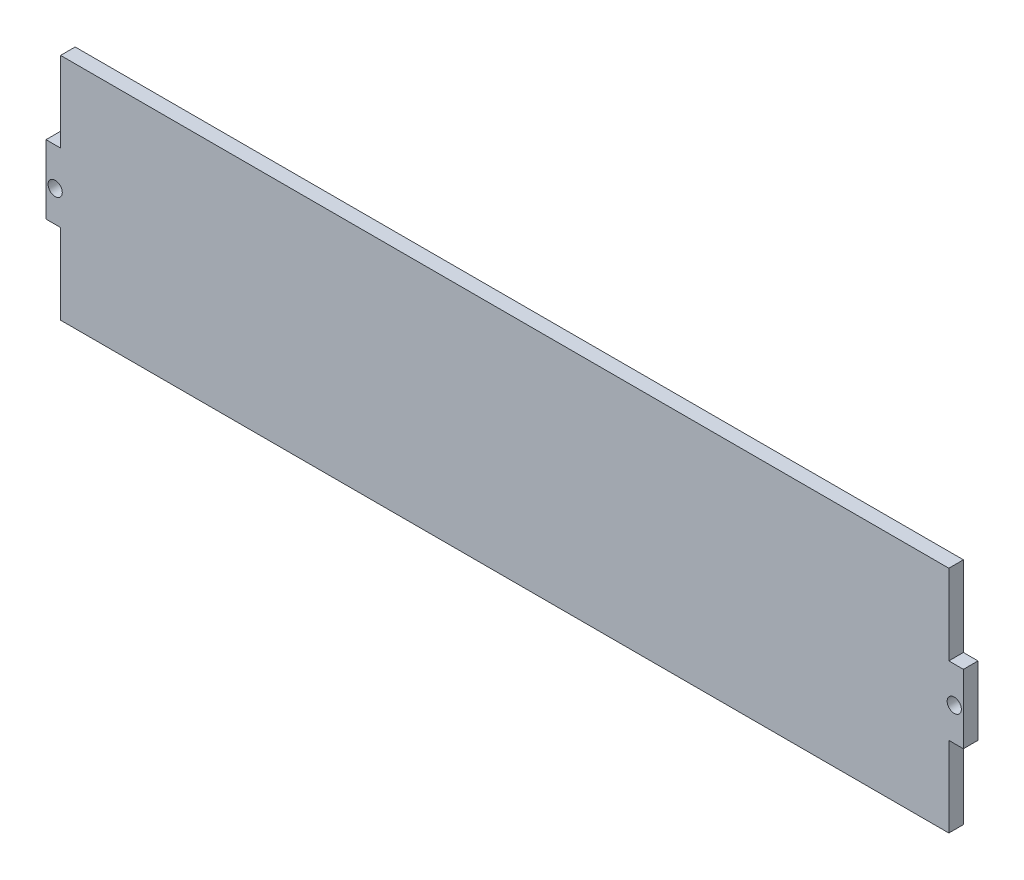
ISO-10303-21;
HEADER;
FILE_DESCRIPTION(('STEP AP214'),'2;1');
FILE_NAME('part.step','',(''),(''),'','','');
FILE_SCHEMA(('AUTOMOTIVE_DESIGN { 1 0 10303 214 1 1 1 1 }'));
ENDSEC;
DATA;
#1=APPLICATION_CONTEXT('core data for automotive mechanical design processes');
#2=APPLICATION_PROTOCOL_DEFINITION('international standard','automotive_design',2000,#1);
#3=PRODUCT_CONTEXT('',#1,'mechanical');
#4=PRODUCT('Part','Part','',(#3));
#5=PRODUCT_RELATED_PRODUCT_CATEGORY('part','',(#4));
#6=PRODUCT_DEFINITION_FORMATION('','',#4);
#7=PRODUCT_DEFINITION_CONTEXT('part definition',#1,'design');
#8=PRODUCT_DEFINITION('design','',#6,#7);
#9=PRODUCT_DEFINITION_SHAPE('','',#8);
#10=(LENGTH_UNIT() NAMED_UNIT(*) SI_UNIT(.MILLI.,.METRE.));
#11=(NAMED_UNIT(*) PLANE_ANGLE_UNIT() SI_UNIT($,.RADIAN.));
#12=(NAMED_UNIT(*) SI_UNIT($,.STERADIAN.) SOLID_ANGLE_UNIT());
#13=UNCERTAINTY_MEASURE_WITH_UNIT(LENGTH_MEASURE(1.E-05),#10,'distance_accuracy_value','');
#14=(GEOMETRIC_REPRESENTATION_CONTEXT(3) GLOBAL_UNCERTAINTY_ASSIGNED_CONTEXT((#13)) GLOBAL_UNIT_ASSIGNED_CONTEXT((#10,
#11,#12)) REPRESENTATION_CONTEXT('',''));
#15=CARTESIAN_POINT('',(0.,0.,0.));
#16=DIRECTION('',(0.,0.,1.));
#17=DIRECTION('',(1.,0.,0.));
#18=AXIS2_PLACEMENT_3D('',#15,#16,#17);
#19=CARTESIAN_POINT('',(-100.,-25.,3.18));
#20=DIRECTION('',(-1.,0.,0.));
#21=DIRECTION('',(0.,0.,1.));
#22=AXIS2_PLACEMENT_3D('',#19,#20,#21);
#23=PLANE('',#22);
#24=DIRECTION('',(0.,0.,1.));
#25=VECTOR('',#24,1.);
#26=CARTESIAN_POINT('',(-100.,-7.5,0.));
#27=LINE('',#26,#25);
#28=CARTESIAN_POINT('',(-100.,-7.5,0.));
#29=VERTEX_POINT('',#28);
#30=CARTESIAN_POINT('',(-100.,-7.5,3.18));
#31=VERTEX_POINT('',#30);
#32=EDGE_CURVE('E196',#29,#31,#27,.T.);
#33=ORIENTED_EDGE('',*,*,#32,.T.);
#34=DIRECTION('',(0.,1.,0.));
#35=VECTOR('',#34,1.);
#36=CARTESIAN_POINT('',(-100.,-25.,3.18));
#37=LINE('',#36,#35);
#38=CARTESIAN_POINT('',(-100.,7.5,3.18));
#39=VERTEX_POINT('',#38);
#40=EDGE_CURVE('E160',#31,#39,#37,.T.);
#41=ORIENTED_EDGE('',*,*,#40,.T.);
#42=DIRECTION('',(0.,0.,1.));
#43=VECTOR('',#42,1.);
#44=CARTESIAN_POINT('',(-100.,7.5,0.));
#45=LINE('',#44,#43);
#46=CARTESIAN_POINT('',(-100.,7.5,0.));
#47=VERTEX_POINT('',#46);
#48=EDGE_CURVE('E178',#47,#39,#45,.T.);
#49=ORIENTED_EDGE('',*,*,#48,.F.);
#50=DIRECTION('',(0.,1.,0.));
#51=VECTOR('',#50,1.);
#52=CARTESIAN_POINT('',(-100.,-25.,0.));
#53=LINE('',#52,#51);
#54=EDGE_CURVE('E162',#29,#47,#53,.T.);
#55=ORIENTED_EDGE('',*,*,#54,.F.);
#56=EDGE_LOOP('',(#33,#41,#49,#55));
#57=FACE_BOUND('',#56,.T.);
#58=ADVANCED_FACE('F39',(#57),#23,.T.);
#59=CARTESIAN_POINT('',(-100.,-25.,3.18));
#60=DIRECTION('',(0.,1.,0.));
#61=DIRECTION('',(0.,0.,1.));
#62=AXIS2_PLACEMENT_3D('',#59,#60,#61);
#63=PLANE('',#62);
#64=DIRECTION('',(1.,0.,0.));
#65=VECTOR('',#64,1.);
#66=CARTESIAN_POINT('',(-100.,-25.,3.18));
#67=LINE('',#66,#65);
#68=CARTESIAN_POINT('',(-96.82,-25.,3.18));
#69=VERTEX_POINT('',#68);
#70=CARTESIAN_POINT('',(96.82,-25.,3.18));
#71=VERTEX_POINT('',#70);
#72=EDGE_CURVE('E11',#69,#71,#67,.T.);
#73=ORIENTED_EDGE('',*,*,#72,.F.);
#74=DIRECTION('',(0.,0.,1.));
#75=VECTOR('',#74,1.);
#76=CARTESIAN_POINT('',(-96.82,-25.,0.));
#77=LINE('',#76,#75);
#78=CARTESIAN_POINT('',(-96.82,-25.,0.));
#79=VERTEX_POINT('',#78);
#80=EDGE_CURVE('E226',#79,#69,#77,.T.);
#81=ORIENTED_EDGE('',*,*,#80,.F.);
#82=DIRECTION('',(1.,0.,0.));
#83=VECTOR('',#82,1.);
#84=CARTESIAN_POINT('',(-100.,-25.,0.));
#85=LINE('',#84,#83);
#86=CARTESIAN_POINT('',(96.82,-25.,0.));
#87=VERTEX_POINT('',#86);
#88=EDGE_CURVE('E42',#79,#87,#85,.T.);
#89=ORIENTED_EDGE('',*,*,#88,.T.);
#90=DIRECTION('',(0.,0.,1.));
#91=VECTOR('',#90,1.);
#92=CARTESIAN_POINT('',(96.82,-25.,0.));
#93=LINE('',#92,#91);
#94=EDGE_CURVE('E221',#87,#71,#93,.T.);
#95=ORIENTED_EDGE('',*,*,#94,.T.);
#96=EDGE_LOOP('',(#73,#81,#89,#95));
#97=FACE_BOUND('',#96,.T.);
#98=ADVANCED_FACE('F307',(#97),#63,.F.);
#99=CARTESIAN_POINT('',(100.,-25.,3.18));
#100=DIRECTION('',(-1.,0.,0.));
#101=DIRECTION('',(0.,0.,1.));
#102=AXIS2_PLACEMENT_3D('',#99,#100,#101);
#103=PLANE('',#102);
#104=DIRECTION('',(0.,1.,0.));
#105=VECTOR('',#104,1.);
#106=CARTESIAN_POINT('',(100.,-25.,0.));
#107=LINE('',#106,#105);
#108=CARTESIAN_POINT('',(100.,-7.5,0.));
#109=VERTEX_POINT('',#108);
#110=CARTESIAN_POINT('',(100.,7.5,0.));
#111=VERTEX_POINT('',#110);
#112=EDGE_CURVE('E149',#109,#111,#107,.T.);
#113=ORIENTED_EDGE('',*,*,#112,.T.);
#114=DIRECTION('',(0.,0.,1.));
#115=VECTOR('',#114,1.);
#116=CARTESIAN_POINT('',(100.,7.5,0.));
#117=LINE('',#116,#115);
#118=CARTESIAN_POINT('',(100.,7.5,3.18));
#119=VERTEX_POINT('',#118);
#120=EDGE_CURVE('E209',#111,#119,#117,.T.);
#121=ORIENTED_EDGE('',*,*,#120,.T.);
#122=DIRECTION('',(0.,1.,0.));
#123=VECTOR('',#122,1.);
#124=CARTESIAN_POINT('',(100.,-25.,3.18));
#125=LINE('',#124,#123);
#126=CARTESIAN_POINT('',(100.,-7.5,3.18));
#127=VERTEX_POINT('',#126);
#128=EDGE_CURVE('E48',#127,#119,#125,.T.);
#129=ORIENTED_EDGE('',*,*,#128,.F.);
#130=DIRECTION('',(0.,0.,1.));
#131=VECTOR('',#130,1.);
#132=CARTESIAN_POINT('',(100.,-7.5,0.));
#133=LINE('',#132,#131);
#134=EDGE_CURVE('E134',#109,#127,#133,.T.);
#135=ORIENTED_EDGE('',*,*,#134,.F.);
#136=EDGE_LOOP('',(#113,#121,#129,#135));
#137=FACE_BOUND('',#136,.T.);
#138=ADVANCED_FACE('F147',(#137),#103,.F.);
#139=CARTESIAN_POINT('',(-100.,25.,3.18));
#140=DIRECTION('',(0.,1.,0.));
#141=DIRECTION('',(0.,0.,1.));
#142=AXIS2_PLACEMENT_3D('',#139,#140,#141);
#143=PLANE('',#142);
#144=DIRECTION('',(0.,0.,1.));
#145=VECTOR('',#144,1.);
#146=CARTESIAN_POINT('',(96.82,25.,0.));
#147=LINE('',#146,#145);
#148=CARTESIAN_POINT('',(96.82,25.,0.));
#149=VERTEX_POINT('',#148);
#150=CARTESIAN_POINT('',(96.82,25.,3.18));
#151=VERTEX_POINT('',#150);
#152=EDGE_CURVE('E203',#149,#151,#147,.T.);
#153=ORIENTED_EDGE('',*,*,#152,.F.);
#154=DIRECTION('',(1.,0.,0.));
#155=VECTOR('',#154,1.);
#156=CARTESIAN_POINT('',(-100.,25.,0.));
#157=LINE('',#156,#155);
#158=CARTESIAN_POINT('',(-96.82,25.,0.));
#159=VERTEX_POINT('',#158);
#160=EDGE_CURVE('E156',#159,#149,#157,.T.);
#161=ORIENTED_EDGE('',*,*,#160,.F.);
#162=DIRECTION('',(0.,0.,1.));
#163=VECTOR('',#162,1.);
#164=CARTESIAN_POINT('',(-96.82,25.,0.));
#165=LINE('',#164,#163);
#166=CARTESIAN_POINT('',(-96.82,25.,3.18));
#167=VERTEX_POINT('',#166);
#168=EDGE_CURVE('E167',#159,#167,#165,.T.);
#169=ORIENTED_EDGE('',*,*,#168,.T.);
#170=DIRECTION('',(1.,0.,0.));
#171=VECTOR('',#170,1.);
#172=CARTESIAN_POINT('',(-100.,25.,3.18));
#173=LINE('',#172,#171);
#174=EDGE_CURVE('E171',#167,#151,#173,.T.);
#175=ORIENTED_EDGE('',*,*,#174,.T.);
#176=EDGE_LOOP('',(#153,#161,#169,#175));
#177=FACE_BOUND('',#176,.T.);
#178=ADVANCED_FACE('F288',(#177),#143,.T.);
#179=CARTESIAN_POINT('',(0.,0.,3.18));
#180=DIRECTION('',(0.,0.,-1.));
#181=DIRECTION('',(-1.,0.,0.));
#182=AXIS2_PLACEMENT_3D('',#179,#180,#181);
#183=PLANE('',#182);
#184=CARTESIAN_POINT('',(-98.,-0.707640919363736,3.18));
#185=DIRECTION('',(0.,0.,1.));
#186=DIRECTION('',(1.,0.,0.));
#187=AXIS2_PLACEMENT_3D('',#184,#185,#186);
#188=CIRCLE('',#187,1.54999999999999);
#189=CARTESIAN_POINT('',(-96.45,-0.707640919363736,3.18));
#190=VERTEX_POINT('',#189);
#191=EDGE_CURVE('E268',#190,#190,#188,.T.);
#192=ORIENTED_EDGE('',*,*,#191,.F.);
#193=EDGE_LOOP('',(#192));
#194=FACE_BOUND('',#193,.T.);
#195=CARTESIAN_POINT('',(98.0021584093861,-0.278752170109062,3.18));
#196=DIRECTION('',(0.,0.,1.));
#197=DIRECTION('',(-1.,0.,0.));
#198=AXIS2_PLACEMENT_3D('',#195,#196,#197);
#199=CIRCLE('',#198,1.54999999999999);
#200=CARTESIAN_POINT('',(99.5521584093861,-0.278752170109062,3.18));
#201=VERTEX_POINT('',#200);
#202=EDGE_CURVE('E260',#201,#201,#199,.T.);
#203=ORIENTED_EDGE('',*,*,#202,.F.);
#204=EDGE_LOOP('',(#203));
#205=FACE_BOUND('',#204,.T.);
#206=ORIENTED_EDGE('',*,*,#40,.F.);
#207=DIRECTION('',(-1.,0.,0.));
#208=VECTOR('',#207,1.);
#209=CARTESIAN_POINT('',(-100.,-7.5,3.18));
#210=LINE('',#209,#208);
#211=CARTESIAN_POINT('',(-96.82,-7.5,3.18));
#212=VERTEX_POINT('',#211);
#213=EDGE_CURVE('E235',#212,#31,#210,.T.);
#214=ORIENTED_EDGE('',*,*,#213,.F.);
#215=DIRECTION('',(0.,1.,0.));
#216=VECTOR('',#215,1.);
#217=CARTESIAN_POINT('',(-96.82,-7.5,3.18));
#218=LINE('',#217,#216);
#219=EDGE_CURVE('E212',#69,#212,#218,.T.);
#220=ORIENTED_EDGE('',*,*,#219,.F.);
#221=ORIENTED_EDGE('',*,*,#72,.T.);
#222=DIRECTION('',(0.,-1.,0.));
#223=VECTOR('',#222,1.);
#224=CARTESIAN_POINT('',(96.82,-25.,3.18));
#225=LINE('',#224,#223);
#226=CARTESIAN_POINT('',(96.82,-7.5,3.18));
#227=VERTEX_POINT('',#226);
#228=EDGE_CURVE('E142',#227,#71,#225,.T.);
#229=ORIENTED_EDGE('',*,*,#228,.F.);
#230=DIRECTION('',(-1.,0.,0.));
#231=VECTOR('',#230,1.);
#232=CARTESIAN_POINT('',(100.,-7.5,3.18));
#233=LINE('',#232,#231);
#234=EDGE_CURVE('E254',#127,#227,#233,.T.);
#235=ORIENTED_EDGE('',*,*,#234,.F.);
#236=ORIENTED_EDGE('',*,*,#128,.T.);
#237=DIRECTION('',(1.,0.,0.));
#238=VECTOR('',#237,1.);
#239=CARTESIAN_POINT('',(100.,7.5,3.18));
#240=LINE('',#239,#238);
#241=CARTESIAN_POINT('',(96.82,7.5,3.18));
#242=VERTEX_POINT('',#241);
#243=EDGE_CURVE('E213',#242,#119,#240,.T.);
#244=ORIENTED_EDGE('',*,*,#243,.F.);
#245=DIRECTION('',(0.,-1.,0.));
#246=VECTOR('',#245,1.);
#247=CARTESIAN_POINT('',(96.82,25.,3.18));
#248=LINE('',#247,#246);
#249=EDGE_CURVE('E217',#151,#242,#248,.T.);
#250=ORIENTED_EDGE('',*,*,#249,.F.);
#251=ORIENTED_EDGE('',*,*,#174,.F.);
#252=DIRECTION('',(0.,1.,0.));
#253=VECTOR('',#252,1.);
#254=CARTESIAN_POINT('',(-96.82,25.,3.18));
#255=LINE('',#254,#253);
#256=CARTESIAN_POINT('',(-96.82,7.5,3.18));
#257=VERTEX_POINT('',#256);
#258=EDGE_CURVE('E188',#257,#167,#255,.T.);
#259=ORIENTED_EDGE('',*,*,#258,.F.);
#260=DIRECTION('',(1.,0.,0.));
#261=VECTOR('',#260,1.);
#262=CARTESIAN_POINT('',(-100.,7.5,3.18));
#263=LINE('',#262,#261);
#264=EDGE_CURVE('E192',#39,#257,#263,.T.);
#265=ORIENTED_EDGE('',*,*,#264,.F.);
#266=EDGE_LOOP('',(#206,#214,#220,#221,#229,#235,#236,#244,#250,#251,#259,#265));
#267=FACE_BOUND('',#266,.T.);
#268=ADVANCED_FACE('F285',(#194,#205,#267),#183,.F.);
#269=CARTESIAN_POINT('',(0.,0.,0.));
#270=DIRECTION('',(0.,0.,-1.));
#271=DIRECTION('',(-1.,0.,0.));
#272=AXIS2_PLACEMENT_3D('',#269,#270,#271);
#273=PLANE('',#272);
#274=CARTESIAN_POINT('',(-98.,-0.707640919363736,0.));
#275=DIRECTION('',(0.,0.,1.));
#276=DIRECTION('',(1.,0.,0.));
#277=AXIS2_PLACEMENT_3D('',#274,#275,#276);
#278=CIRCLE('',#277,1.54999999999999);
#279=CARTESIAN_POINT('',(-96.45,-0.707640919363736,0.));
#280=VERTEX_POINT('',#279);
#281=EDGE_CURVE('E257',#280,#280,#278,.T.);
#282=ORIENTED_EDGE('',*,*,#281,.T.);
#283=EDGE_LOOP('',(#282));
#284=FACE_BOUND('',#283,.T.);
#285=CARTESIAN_POINT('',(98.0021584093861,-0.278752170109062,0.));
#286=DIRECTION('',(0.,0.,1.));
#287=DIRECTION('',(-1.,0.,0.));
#288=AXIS2_PLACEMENT_3D('',#285,#286,#287);
#289=CIRCLE('',#288,1.54999999999999);
#290=CARTESIAN_POINT('',(99.5521584093861,-0.278752170109062,0.));
#291=VERTEX_POINT('',#290);
#292=EDGE_CURVE('E264',#291,#291,#289,.T.);
#293=ORIENTED_EDGE('',*,*,#292,.T.);
#294=EDGE_LOOP('',(#293));
#295=FACE_BOUND('',#294,.T.);
#296=DIRECTION('',(-1.,0.,0.));
#297=VECTOR('',#296,1.);
#298=CARTESIAN_POINT('',(-100.,-7.5,0.));
#299=LINE('',#298,#297);
#300=CARTESIAN_POINT('',(-96.82,-7.5,0.));
#301=VERTEX_POINT('',#300);
#302=EDGE_CURVE('E56',#301,#29,#299,.T.);
#303=ORIENTED_EDGE('',*,*,#302,.T.);
#304=ORIENTED_EDGE('',*,*,#54,.T.);
#305=DIRECTION('',(1.,0.,0.));
#306=VECTOR('',#305,1.);
#307=CARTESIAN_POINT('',(-100.,7.5,0.));
#308=LINE('',#307,#306);
#309=CARTESIAN_POINT('',(-96.82,7.5,0.));
#310=VERTEX_POINT('',#309);
#311=EDGE_CURVE('E191',#47,#310,#308,.T.);
#312=ORIENTED_EDGE('',*,*,#311,.T.);
#313=DIRECTION('',(0.,1.,0.));
#314=VECTOR('',#313,1.);
#315=CARTESIAN_POINT('',(-96.82,25.,0.));
#316=LINE('',#315,#314);
#317=EDGE_CURVE('E182',#310,#159,#316,.T.);
#318=ORIENTED_EDGE('',*,*,#317,.T.);
#319=ORIENTED_EDGE('',*,*,#160,.T.);
#320=DIRECTION('',(0.,-1.,0.));
#321=VECTOR('',#320,1.);
#322=CARTESIAN_POINT('',(96.82,25.,0.));
#323=LINE('',#322,#321);
#324=CARTESIAN_POINT('',(96.82,7.5,0.));
#325=VERTEX_POINT('',#324);
#326=EDGE_CURVE('E216',#149,#325,#323,.T.);
#327=ORIENTED_EDGE('',*,*,#326,.T.);
#328=DIRECTION('',(1.,0.,0.));
#329=VECTOR('',#328,1.);
#330=CARTESIAN_POINT('',(100.,7.5,0.));
#331=LINE('',#330,#329);
#332=EDGE_CURVE('E64',#325,#111,#331,.T.);
#333=ORIENTED_EDGE('',*,*,#332,.T.);
#334=ORIENTED_EDGE('',*,*,#112,.F.);
#335=DIRECTION('',(-1.,0.,0.));
#336=VECTOR('',#335,1.);
#337=CARTESIAN_POINT('',(100.,-7.5,0.));
#338=LINE('',#337,#336);
#339=CARTESIAN_POINT('',(96.82,-7.5,0.));
#340=VERTEX_POINT('',#339);
#341=EDGE_CURVE('E130',#109,#340,#338,.T.);
#342=ORIENTED_EDGE('',*,*,#341,.T.);
#343=DIRECTION('',(0.,-1.,0.));
#344=VECTOR('',#343,1.);
#345=CARTESIAN_POINT('',(96.82,-25.,0.));
#346=LINE('',#345,#344);
#347=EDGE_CURVE('E141',#340,#87,#346,.T.);
#348=ORIENTED_EDGE('',*,*,#347,.T.);
#349=ORIENTED_EDGE('',*,*,#88,.F.);
#350=DIRECTION('',(0.,1.,0.));
#351=VECTOR('',#350,1.);
#352=CARTESIAN_POINT('',(-96.82,-7.5,0.));
#353=LINE('',#352,#351);
#354=EDGE_CURVE('E238',#79,#301,#353,.T.);
#355=ORIENTED_EDGE('',*,*,#354,.T.);
#356=EDGE_LOOP('',(#303,#304,#312,#318,#319,#327,#333,#334,#342,#348,#349,#355));
#357=FACE_BOUND('',#356,.T.);
#358=ADVANCED_FACE('F153',(#284,#295,#357),#273,.T.);
#359=CARTESIAN_POINT('',(-96.82,25.,0.));
#360=DIRECTION('',(1.,0.,0.));
#361=DIRECTION('',(0.,0.,-1.));
#362=AXIS2_PLACEMENT_3D('',#359,#360,#361);
#363=PLANE('',#362);
#364=ORIENTED_EDGE('',*,*,#258,.T.);
#365=ORIENTED_EDGE('',*,*,#168,.F.);
#366=ORIENTED_EDGE('',*,*,#317,.F.);
#367=DIRECTION('',(0.,0.,1.));
#368=VECTOR('',#367,1.);
#369=CARTESIAN_POINT('',(-96.82,7.5,0.));
#370=LINE('',#369,#368);
#371=EDGE_CURVE('E181',#310,#257,#370,.T.);
#372=ORIENTED_EDGE('',*,*,#371,.T.);
#373=EDGE_LOOP('',(#364,#365,#366,#372));
#374=FACE_BOUND('',#373,.T.);
#375=ADVANCED_FACE('F320',(#374),#363,.F.);
#376=CARTESIAN_POINT('',(-100.,7.5,0.));
#377=DIRECTION('',(0.,-1.,0.));
#378=DIRECTION('',(1.,0.,0.));
#379=AXIS2_PLACEMENT_3D('',#376,#377,#378);
#380=PLANE('',#379);
#381=ORIENTED_EDGE('',*,*,#264,.T.);
#382=ORIENTED_EDGE('',*,*,#371,.F.);
#383=ORIENTED_EDGE('',*,*,#311,.F.);
#384=ORIENTED_EDGE('',*,*,#48,.T.);
#385=EDGE_LOOP('',(#381,#382,#383,#384));
#386=FACE_BOUND('',#385,.T.);
#387=ADVANCED_FACE('F312',(#386),#380,.F.);
#388=CARTESIAN_POINT('',(96.82,-25.,0.));
#389=DIRECTION('',(-1.,0.,0.));
#390=DIRECTION('',(0.,0.,1.));
#391=AXIS2_PLACEMENT_3D('',#388,#389,#390);
#392=PLANE('',#391);
#393=ORIENTED_EDGE('',*,*,#228,.T.);
#394=ORIENTED_EDGE('',*,*,#94,.F.);
#395=ORIENTED_EDGE('',*,*,#347,.F.);
#396=DIRECTION('',(0.,0.,1.));
#397=VECTOR('',#396,1.);
#398=CARTESIAN_POINT('',(96.82,-7.5,0.));
#399=LINE('',#398,#397);
#400=EDGE_CURVE('E136',#340,#227,#399,.T.);
#401=ORIENTED_EDGE('',*,*,#400,.T.);
#402=EDGE_LOOP('',(#393,#394,#395,#401));
#403=FACE_BOUND('',#402,.T.);
#404=ADVANCED_FACE('F310',(#403),#392,.F.);
#405=CARTESIAN_POINT('',(100.,-7.5,0.));
#406=DIRECTION('',(0.,1.,0.));
#407=DIRECTION('',(0.,0.,1.));
#408=AXIS2_PLACEMENT_3D('',#405,#406,#407);
#409=PLANE('',#408);
#410=ORIENTED_EDGE('',*,*,#234,.T.);
#411=ORIENTED_EDGE('',*,*,#400,.F.);
#412=ORIENTED_EDGE('',*,*,#341,.F.);
#413=ORIENTED_EDGE('',*,*,#134,.T.);
#414=EDGE_LOOP('',(#410,#411,#412,#413));
#415=FACE_BOUND('',#414,.T.);
#416=ADVANCED_FACE('F133',(#415),#409,.F.);
#417=CARTESIAN_POINT('',(100.,7.5,0.));
#418=DIRECTION('',(0.,-1.,0.));
#419=DIRECTION('',(0.,0.,-1.));
#420=AXIS2_PLACEMENT_3D('',#417,#418,#419);
#421=PLANE('',#420);
#422=ORIENTED_EDGE('',*,*,#243,.T.);
#423=ORIENTED_EDGE('',*,*,#120,.F.);
#424=ORIENTED_EDGE('',*,*,#332,.F.);
#425=DIRECTION('',(0.,0.,1.));
#426=VECTOR('',#425,1.);
#427=CARTESIAN_POINT('',(96.82,7.5,0.));
#428=LINE('',#427,#426);
#429=EDGE_CURVE('E206',#325,#242,#428,.T.);
#430=ORIENTED_EDGE('',*,*,#429,.T.);
#431=EDGE_LOOP('',(#422,#423,#424,#430));
#432=FACE_BOUND('',#431,.T.);
#433=ADVANCED_FACE('F318',(#432),#421,.F.);
#434=CARTESIAN_POINT('',(96.82,25.,0.));
#435=DIRECTION('',(-1.,0.,0.));
#436=DIRECTION('',(0.,0.,1.));
#437=AXIS2_PLACEMENT_3D('',#434,#435,#436);
#438=PLANE('',#437);
#439=ORIENTED_EDGE('',*,*,#249,.T.);
#440=ORIENTED_EDGE('',*,*,#429,.F.);
#441=ORIENTED_EDGE('',*,*,#326,.F.);
#442=ORIENTED_EDGE('',*,*,#152,.T.);
#443=EDGE_LOOP('',(#439,#440,#441,#442));
#444=FACE_BOUND('',#443,.T.);
#445=ADVANCED_FACE('F346',(#444),#438,.F.);
#446=CARTESIAN_POINT('',(-100.,-7.5,0.));
#447=DIRECTION('',(0.,1.,0.));
#448=DIRECTION('',(0.,0.,1.));
#449=AXIS2_PLACEMENT_3D('',#446,#447,#448);
#450=PLANE('',#449);
#451=ORIENTED_EDGE('',*,*,#213,.T.);
#452=ORIENTED_EDGE('',*,*,#32,.F.);
#453=ORIENTED_EDGE('',*,*,#302,.F.);
#454=DIRECTION('',(0.,0.,1.));
#455=VECTOR('',#454,1.);
#456=CARTESIAN_POINT('',(-96.82,-7.5,0.));
#457=LINE('',#456,#455);
#458=EDGE_CURVE('E229',#301,#212,#457,.T.);
#459=ORIENTED_EDGE('',*,*,#458,.T.);
#460=EDGE_LOOP('',(#451,#452,#453,#459));
#461=FACE_BOUND('',#460,.T.);
#462=ADVANCED_FACE('F300',(#461),#450,.F.);
#463=CARTESIAN_POINT('',(-96.82,-7.5,0.));
#464=DIRECTION('',(1.,0.,0.));
#465=DIRECTION('',(0.,0.,-1.));
#466=AXIS2_PLACEMENT_3D('',#463,#464,#465);
#467=PLANE('',#466);
#468=ORIENTED_EDGE('',*,*,#219,.T.);
#469=ORIENTED_EDGE('',*,*,#458,.F.);
#470=ORIENTED_EDGE('',*,*,#354,.F.);
#471=ORIENTED_EDGE('',*,*,#80,.T.);
#472=EDGE_LOOP('',(#468,#469,#470,#471));
#473=FACE_BOUND('',#472,.T.);
#474=ADVANCED_FACE('F304',(#473),#467,.F.);
#475=CARTESIAN_POINT('',(98.0021584093861,-0.278752170109062,0.));
#476=DIRECTION('',(0.,0.,1.));
#477=DIRECTION('',(1.,0.,0.));
#478=AXIS2_PLACEMENT_3D('',#475,#476,#477);
#479=CYLINDRICAL_SURFACE('',#478,1.54999999999999);
#480=CARTESIAN_POINT('',(99.5521584093861,-0.278752170109062,0.));
#481=CARTESIAN_POINT('',(99.5521584093861,-0.278752170109062,0.033125));
#482=CARTESIAN_POINT('',(99.5521584093861,-0.278752170109062,0.06625));
#483=CARTESIAN_POINT('',(99.5521584093861,-0.278752170109062,0.1325));
#484=CARTESIAN_POINT('',(99.5521584093861,-0.278752170109062,0.165625));
#485=CARTESIAN_POINT('',(99.5521584093861,-0.278752170109062,0.231875));
#486=CARTESIAN_POINT('',(99.5521584093861,-0.278752170109062,0.265));
#487=CARTESIAN_POINT('',(99.5521584093861,-0.278752170109062,0.33125));
#488=CARTESIAN_POINT('',(99.5521584093861,-0.278752170109062,0.364375));
#489=CARTESIAN_POINT('',(99.5521584093861,-0.278752170109062,0.430625));
#490=CARTESIAN_POINT('',(99.5521584093861,-0.278752170109062,0.46375));
#491=CARTESIAN_POINT('',(99.5521584093861,-0.278752170109062,0.53));
#492=CARTESIAN_POINT('',(99.5521584093861,-0.278752170109062,0.563125));
#493=CARTESIAN_POINT('',(99.5521584093861,-0.278752170109062,0.629375));
#494=CARTESIAN_POINT('',(99.5521584093861,-0.278752170109062,0.6625));
#495=CARTESIAN_POINT('',(99.5521584093861,-0.278752170109062,0.72875));
#496=CARTESIAN_POINT('',(99.5521584093861,-0.278752170109062,0.761875));
#497=CARTESIAN_POINT('',(99.5521584093861,-0.278752170109062,0.828125));
#498=CARTESIAN_POINT('',(99.5521584093861,-0.278752170109062,0.86125));
#499=CARTESIAN_POINT('',(99.5521584093861,-0.278752170109062,0.9275));
#500=CARTESIAN_POINT('',(99.5521584093861,-0.278752170109062,0.960625));
#501=CARTESIAN_POINT('',(99.5521584093861,-0.278752170109062,1.026875));
#502=CARTESIAN_POINT('',(99.5521584093861,-0.278752170109062,1.06));
#503=CARTESIAN_POINT('',(99.5521584093861,-0.278752170109062,1.12625));
#504=CARTESIAN_POINT('',(99.5521584093861,-0.278752170109062,1.159375));
#505=CARTESIAN_POINT('',(99.5521584093861,-0.278752170109062,1.225625));
#506=CARTESIAN_POINT('',(99.5521584093861,-0.278752170109062,1.25875));
#507=CARTESIAN_POINT('',(99.5521584093861,-0.278752170109062,1.325));
#508=CARTESIAN_POINT('',(99.5521584093861,-0.278752170109062,1.358125));
#509=CARTESIAN_POINT('',(99.5521584093861,-0.278752170109062,1.424375));
#510=CARTESIAN_POINT('',(99.5521584093861,-0.278752170109062,1.4575));
#511=CARTESIAN_POINT('',(99.5521584093861,-0.278752170109062,1.52375));
#512=CARTESIAN_POINT('',(99.5521584093861,-0.278752170109062,1.556875));
#513=CARTESIAN_POINT('',(99.5521584093861,-0.278752170109062,1.623125));
#514=CARTESIAN_POINT('',(99.5521584093861,-0.278752170109062,1.65625));
#515=CARTESIAN_POINT('',(99.5521584093861,-0.278752170109062,1.7225));
#516=CARTESIAN_POINT('',(99.5521584093861,-0.278752170109062,1.755625));
#517=CARTESIAN_POINT('',(99.5521584093861,-0.278752170109062,1.821875));
#518=CARTESIAN_POINT('',(99.5521584093861,-0.278752170109062,1.855));
#519=CARTESIAN_POINT('',(99.5521584093861,-0.278752170109062,1.92125));
#520=CARTESIAN_POINT('',(99.5521584093861,-0.278752170109062,1.954375));
#521=CARTESIAN_POINT('',(99.5521584093861,-0.278752170109062,2.020625));
#522=CARTESIAN_POINT('',(99.5521584093861,-0.278752170109062,2.05375));
#523=CARTESIAN_POINT('',(99.5521584093861,-0.278752170109062,2.12));
#524=CARTESIAN_POINT('',(99.5521584093861,-0.278752170109062,2.153125));
#525=CARTESIAN_POINT('',(99.5521584093861,-0.278752170109062,2.219375));
#526=CARTESIAN_POINT('',(99.5521584093861,-0.278752170109062,2.2525));
#527=CARTESIAN_POINT('',(99.5521584093861,-0.278752170109062,2.31875));
#528=CARTESIAN_POINT('',(99.5521584093861,-0.278752170109062,2.351875));
#529=CARTESIAN_POINT('',(99.5521584093861,-0.278752170109062,2.418125));
#530=CARTESIAN_POINT('',(99.5521584093861,-0.278752170109062,2.45125));
#531=CARTESIAN_POINT('',(99.5521584093861,-0.278752170109062,2.5175));
#532=CARTESIAN_POINT('',(99.5521584093861,-0.278752170109062,2.550625));
#533=CARTESIAN_POINT('',(99.5521584093861,-0.278752170109062,2.616875));
#534=CARTESIAN_POINT('',(99.5521584093861,-0.278752170109062,2.65));
#535=CARTESIAN_POINT('',(99.5521584093861,-0.278752170109062,2.71625));
#536=CARTESIAN_POINT('',(99.5521584093861,-0.278752170109062,2.749375));
#537=CARTESIAN_POINT('',(99.5521584093861,-0.278752170109062,2.815625));
#538=CARTESIAN_POINT('',(99.5521584093861,-0.278752170109062,2.84875));
#539=CARTESIAN_POINT('',(99.5521584093861,-0.278752170109062,2.915));
#540=CARTESIAN_POINT('',(99.5521584093861,-0.278752170109062,2.948125));
#541=CARTESIAN_POINT('',(99.5521584093861,-0.278752170109062,3.014375));
#542=CARTESIAN_POINT('',(99.5521584093861,-0.278752170109062,3.0475));
#543=CARTESIAN_POINT('',(99.5521584093861,-0.278752170109062,3.11375));
#544=CARTESIAN_POINT('',(99.5521584093861,-0.278752170109062,3.146875));
#545=CARTESIAN_POINT('',(99.5521584093861,-0.278752170109062,3.18));
#546=B_SPLINE_CURVE_WITH_KNOTS('',3,(#480,#481,#482,#483,#484,#485,#486,#487,#488,#489,#490,
#491,#492,#493,#494,#495,#496,#497,#498,#499,#500,#501,#502,#503,#504,#505,#506,#507,#508,#509,
#510,#511,#512,#513,#514,#515,#516,#517,#518,#519,#520,#521,#522,#523,#524,#525,#526,#527,#528,
#529,#530,#531,#532,#533,#534,#535,#536,#537,#538,#539,#540,#541,#542,#543,#544,#545),
.UNSPECIFIED.,.F.,.F.,(4,2,2,2,2,2,2,2,2,2,2,2,2,2,2,2,2,2,2,2,2,2,2,2,2,2,2,2,2,2,2,2,4),(0.,
0.099375,0.19875,0.298125,0.3975,0.496875,0.59625,0.695625,0.795,0.894375,0.99375,1.093125,
1.1925,1.291875,1.39125,1.490625,1.59,1.689375,1.78875,1.888125,1.9875,2.086875,2.18625,
2.285625,2.385,2.484375,2.58375,2.683125,2.7825,2.881875,2.98125,3.080625,3.18),.UNSPECIFIED.);
#547=EDGE_CURVE('BSEAM281',#291,#201,#546,.T.);
#548=ORIENTED_EDGE('',*,*,#292,.F.);
#549=ORIENTED_EDGE('',*,*,#202,.T.);
#550=ORIENTED_EDGE('',*,*,#547,.T.);
#551=ORIENTED_EDGE('',*,*,#547,.F.);
#552=EDGE_LOOP('',(#548,#550,#549,#551));
#553=FACE_BOUND('',#552,.T.);
#554=ADVANCED_FACE('F281',(#553),#479,.F.);
#555=CARTESIAN_POINT('',(-98.,-0.707640919363736,0.));
#556=DIRECTION('',(0.,0.,1.));
#557=DIRECTION('',(1.,0.,0.));
#558=AXIS2_PLACEMENT_3D('',#555,#556,#557);
#559=CYLINDRICAL_SURFACE('',#558,1.54999999999999);
#560=CARTESIAN_POINT('',(-96.45,-0.707640919363736,0.));
#561=CARTESIAN_POINT('',(-96.45,-0.707640919363736,0.033125));
#562=CARTESIAN_POINT('',(-96.45,-0.707640919363736,0.06625));
#563=CARTESIAN_POINT('',(-96.45,-0.707640919363736,0.1325));
#564=CARTESIAN_POINT('',(-96.45,-0.707640919363736,0.165625));
#565=CARTESIAN_POINT('',(-96.45,-0.707640919363736,0.231875));
#566=CARTESIAN_POINT('',(-96.45,-0.707640919363736,0.265));
#567=CARTESIAN_POINT('',(-96.45,-0.707640919363736,0.33125));
#568=CARTESIAN_POINT('',(-96.45,-0.707640919363736,0.364375));
#569=CARTESIAN_POINT('',(-96.45,-0.707640919363736,0.430625));
#570=CARTESIAN_POINT('',(-96.45,-0.707640919363736,0.46375));
#571=CARTESIAN_POINT('',(-96.45,-0.707640919363736,0.53));
#572=CARTESIAN_POINT('',(-96.45,-0.707640919363736,0.563125));
#573=CARTESIAN_POINT('',(-96.45,-0.707640919363736,0.629375));
#574=CARTESIAN_POINT('',(-96.45,-0.707640919363736,0.6625));
#575=CARTESIAN_POINT('',(-96.45,-0.707640919363736,0.72875));
#576=CARTESIAN_POINT('',(-96.45,-0.707640919363736,0.761875));
#577=CARTESIAN_POINT('',(-96.45,-0.707640919363736,0.828125));
#578=CARTESIAN_POINT('',(-96.45,-0.707640919363736,0.86125));
#579=CARTESIAN_POINT('',(-96.45,-0.707640919363736,0.9275));
#580=CARTESIAN_POINT('',(-96.45,-0.707640919363736,0.960625));
#581=CARTESIAN_POINT('',(-96.45,-0.707640919363736,1.026875));
#582=CARTESIAN_POINT('',(-96.45,-0.707640919363736,1.06));
#583=CARTESIAN_POINT('',(-96.45,-0.707640919363736,1.12625));
#584=CARTESIAN_POINT('',(-96.45,-0.707640919363736,1.159375));
#585=CARTESIAN_POINT('',(-96.45,-0.707640919363736,1.225625));
#586=CARTESIAN_POINT('',(-96.45,-0.707640919363736,1.25875));
#587=CARTESIAN_POINT('',(-96.45,-0.707640919363736,1.325));
#588=CARTESIAN_POINT('',(-96.45,-0.707640919363736,1.358125));
#589=CARTESIAN_POINT('',(-96.45,-0.707640919363736,1.424375));
#590=CARTESIAN_POINT('',(-96.45,-0.707640919363736,1.4575));
#591=CARTESIAN_POINT('',(-96.45,-0.707640919363736,1.52375));
#592=CARTESIAN_POINT('',(-96.45,-0.707640919363736,1.556875));
#593=CARTESIAN_POINT('',(-96.45,-0.707640919363736,1.623125));
#594=CARTESIAN_POINT('',(-96.45,-0.707640919363736,1.65625));
#595=CARTESIAN_POINT('',(-96.45,-0.707640919363736,1.7225));
#596=CARTESIAN_POINT('',(-96.45,-0.707640919363736,1.755625));
#597=CARTESIAN_POINT('',(-96.45,-0.707640919363736,1.821875));
#598=CARTESIAN_POINT('',(-96.45,-0.707640919363736,1.855));
#599=CARTESIAN_POINT('',(-96.45,-0.707640919363736,1.92125));
#600=CARTESIAN_POINT('',(-96.45,-0.707640919363736,1.954375));
#601=CARTESIAN_POINT('',(-96.45,-0.707640919363736,2.020625));
#602=CARTESIAN_POINT('',(-96.45,-0.707640919363736,2.05375));
#603=CARTESIAN_POINT('',(-96.45,-0.707640919363736,2.12));
#604=CARTESIAN_POINT('',(-96.45,-0.707640919363736,2.153125));
#605=CARTESIAN_POINT('',(-96.45,-0.707640919363736,2.219375));
#606=CARTESIAN_POINT('',(-96.45,-0.707640919363736,2.2525));
#607=CARTESIAN_POINT('',(-96.45,-0.707640919363736,2.31875));
#608=CARTESIAN_POINT('',(-96.45,-0.707640919363736,2.351875));
#609=CARTESIAN_POINT('',(-96.45,-0.707640919363736,2.418125));
#610=CARTESIAN_POINT('',(-96.45,-0.707640919363736,2.45125));
#611=CARTESIAN_POINT('',(-96.45,-0.707640919363736,2.5175));
#612=CARTESIAN_POINT('',(-96.45,-0.707640919363736,2.550625));
#613=CARTESIAN_POINT('',(-96.45,-0.707640919363736,2.616875));
#614=CARTESIAN_POINT('',(-96.45,-0.707640919363736,2.65));
#615=CARTESIAN_POINT('',(-96.45,-0.707640919363736,2.71625));
#616=CARTESIAN_POINT('',(-96.45,-0.707640919363736,2.749375));
#617=CARTESIAN_POINT('',(-96.45,-0.707640919363736,2.815625));
#618=CARTESIAN_POINT('',(-96.45,-0.707640919363736,2.84875));
#619=CARTESIAN_POINT('',(-96.45,-0.707640919363736,2.915));
#620=CARTESIAN_POINT('',(-96.45,-0.707640919363736,2.948125));
#621=CARTESIAN_POINT('',(-96.45,-0.707640919363736,3.014375));
#622=CARTESIAN_POINT('',(-96.45,-0.707640919363736,3.0475));
#623=CARTESIAN_POINT('',(-96.45,-0.707640919363736,3.11375));
#624=CARTESIAN_POINT('',(-96.45,-0.707640919363736,3.146875));
#625=CARTESIAN_POINT('',(-96.45,-0.707640919363736,3.18));
#626=B_SPLINE_CURVE_WITH_KNOTS('',3,(#560,#561,#562,#563,#564,#565,#566,#567,#568,#569,#570,
#571,#572,#573,#574,#575,#576,#577,#578,#579,#580,#581,#582,#583,#584,#585,#586,#587,#588,#589,
#590,#591,#592,#593,#594,#595,#596,#597,#598,#599,#600,#601,#602,#603,#604,#605,#606,#607,#608,
#609,#610,#611,#612,#613,#614,#615,#616,#617,#618,#619,#620,#621,#622,#623,#624,#625),
.UNSPECIFIED.,.F.,.F.,(4,2,2,2,2,2,2,2,2,2,2,2,2,2,2,2,2,2,2,2,2,2,2,2,2,2,2,2,2,2,2,2,4),(0.,
0.099375,0.19875,0.298125,0.3975,0.496875,0.59625,0.695625,0.795,0.894375,0.99375,1.093125,
1.1925,1.291875,1.39125,1.490625,1.59,1.689375,1.78875,1.888125,1.9875,2.086875,2.18625,
2.285625,2.385,2.484375,2.58375,2.683125,2.7825,2.881875,2.98125,3.080625,3.18),.UNSPECIFIED.);
#627=EDGE_CURVE('BSEAM278',#280,#190,#626,.T.);
#628=ORIENTED_EDGE('',*,*,#281,.F.);
#629=ORIENTED_EDGE('',*,*,#191,.T.);
#630=ORIENTED_EDGE('',*,*,#627,.T.);
#631=ORIENTED_EDGE('',*,*,#627,.F.);
#632=EDGE_LOOP('',(#628,#630,#629,#631));
#633=FACE_BOUND('',#632,.T.);
#634=ADVANCED_FACE('F278',(#633),#559,.F.);
#635=CLOSED_SHELL('',(#58,#98,#138,#178,#268,#358,#375,#387,#404,#416,#433,#445,#462,#474,#554,#634));
#636=MANIFOLD_SOLID_BREP('B2',#635);
#637=ADVANCED_BREP_SHAPE_REPRESENTATION('',(#18,#636),#14);
#638=SHAPE_DEFINITION_REPRESENTATION(#9,#637);
ENDSEC;
END-ISO-10303-21;
